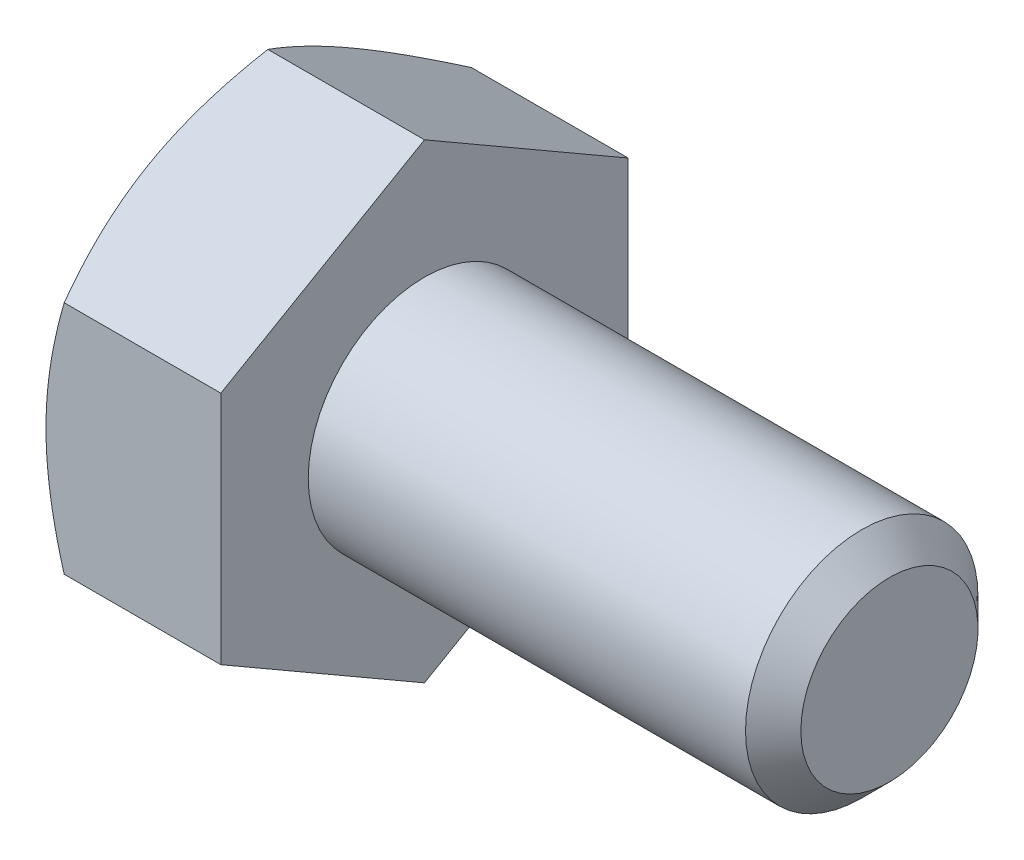
ISO-10303-21;
HEADER;
FILE_DESCRIPTION(('STEP AP214'),'2;1');
FILE_NAME('part.step','',(''),(''),'','','');
FILE_SCHEMA(('AUTOMOTIVE_DESIGN { 1 0 10303 214 1 1 1 1 }'));
ENDSEC;
DATA;
#1=APPLICATION_CONTEXT('core data for automotive mechanical design processes');
#2=APPLICATION_PROTOCOL_DEFINITION('international standard','automotive_design',2000,#1);
#3=PRODUCT_CONTEXT('',#1,'mechanical');
#4=PRODUCT('Part','Part','',(#3));
#5=PRODUCT_RELATED_PRODUCT_CATEGORY('part','',(#4));
#6=PRODUCT_DEFINITION_FORMATION('','',#4);
#7=PRODUCT_DEFINITION_CONTEXT('part definition',#1,'design');
#8=PRODUCT_DEFINITION('design','',#6,#7);
#9=PRODUCT_DEFINITION_SHAPE('','',#8);
#10=(LENGTH_UNIT() NAMED_UNIT(*) SI_UNIT(.MILLI.,.METRE.));
#11=(NAMED_UNIT(*) PLANE_ANGLE_UNIT() SI_UNIT($,.RADIAN.));
#12=(NAMED_UNIT(*) SI_UNIT($,.STERADIAN.) SOLID_ANGLE_UNIT());
#13=UNCERTAINTY_MEASURE_WITH_UNIT(LENGTH_MEASURE(1.E-05),#10,'distance_accuracy_value','');
#14=(GEOMETRIC_REPRESENTATION_CONTEXT(3) GLOBAL_UNCERTAINTY_ASSIGNED_CONTEXT((#13)) GLOBAL_UNIT_ASSIGNED_CONTEXT((#10,
#11,#12)) REPRESENTATION_CONTEXT('',''));
#15=CARTESIAN_POINT('',(0.,0.,0.));
#16=DIRECTION('',(0.,0.,1.));
#17=DIRECTION('',(1.,0.,0.));
#18=AXIS2_PLACEMENT_3D('',#15,#16,#17);
#19=CARTESIAN_POINT('',(4.7752,3.21156860739421,-5.5626));
#20=DIRECTION('',(0.,-0.866025403784438,0.500000000000001));
#21=DIRECTION('',(0.,-0.500000000000001,-0.866025403784438));
#22=AXIS2_PLACEMENT_3D('',#19,#20,#21);
#23=PLANE('',#22);
#24=CARTESIAN_POINT('',(0.496898061070143,6.42325268484227,0.0002));
#25=CARTESIAN_POINT('',(0.45614620225513,6.35265858120791,-0.122072574209491));
#26=CARTESIAN_POINT('',(0.417243775308723,6.2818012683745,-0.244801040124762));
#27=CARTESIAN_POINT('',(0.343647161560542,6.13951120287093,-0.491254662989243));
#28=CARTESIAN_POINT('',(0.308954790139044,6.06807821602765,-0.614980225538197));
#29=CARTESIAN_POINT('',(0.211873701066855,5.85263550648139,-0.98813794459262));
#30=CARTESIAN_POINT('',(0.156654841923373,5.70777535201369,-1.23904309212296));
#31=CARTESIAN_POINT('',(0.0919037861815275,5.49099476252075,-1.61451808721946));
#32=CARTESIAN_POINT('',(0.0734579983429333,5.41972205873199,-1.7379660313744));
#33=CARTESIAN_POINT('',(0.0425268916674615,5.27685459691414,-1.98541973399132));
#34=CARTESIAN_POINT('',(0.030041046189008,5.20525986790488,-2.10942544218948));
#35=CARTESIAN_POINT('',(0.0113480299394708,5.06194605565757,-2.35765224642821));
#36=CARTESIAN_POINT('',(0.00513373340584708,4.9902272065059,-2.48187293701928));
#37=CARTESIAN_POINT('',(-0.000889599359095551,4.84672720555795,-2.7304222295473));
#38=CARTESIAN_POINT('',(-0.000698833448296274,4.7749460557547,-2.85475082803225));
#39=CARTESIAN_POINT('',(0.00862810136342285,4.57828637012706,-3.19537539533985));
#40=CARTESIAN_POINT('',(0.0242873955350757,4.4534722013835,-3.41155987710816));
#41=CARTESIAN_POINT('',(0.0739443233816052,4.20467287416474,-3.84249295274001));
#42=CARTESIAN_POINT('',(0.107958931423458,4.08068859075412,-4.05724003094723));
#43=CARTESIAN_POINT('',(0.192986041409677,3.83138850679899,-4.4890404426887));
#44=CARTESIAN_POINT('',(0.244358813937401,3.70610416511176,-4.70603928788379));
#45=CARTESIAN_POINT('',(0.360954456999593,3.45740388365365,-5.13680081122592));
#46=CARTESIAN_POINT('',(0.426149937617058,3.33398475856357,-5.35056900650764));
#47=CARTESIAN_POINT('',(0.496898061070137,3.21145313734037,-5.5628));
#48=B_SPLINE_CURVE_WITH_KNOTS('',3,(#24,#25,#26,#27,#28,#29,#30,#31,#32,#33,#34,#35,#36,#37,#38,
#39,#40,#41,#42,#43,#44,#45,#46,#47),.UNSPECIFIED.,.F.,.F.,(4,2,2,2,2,2,2,2,2,2,2,4),(0.,
0.44082011856227,0.8818296488474,1.76568130465017,2.19678242164486,2.62784543796583,
3.05841812523868,3.48897751176353,4.23854798324166,4.98881282275669,5.75571809391027,
6.52111769989992),.UNSPECIFIED.);
#49=CARTESIAN_POINT('',(0.496831392605788,6.42313721478843,0.));
#50=VERTEX_POINT('',#49);
#51=CARTESIAN_POINT('',(0.,4.81735291109131,-2.78130000000001));
#52=VERTEX_POINT('',#51);
#53=EDGE_CURVE('E48',#50,#52,#48,.T.);
#54=ORIENTED_EDGE('',*,*,#53,.F.);
#55=DIRECTION('',(-1.,0.,0.));
#56=VECTOR('',#55,1.);
#57=CARTESIAN_POINT('',(4.7752,6.42313721478843,0.));
#58=LINE('',#57,#56);
#59=CARTESIAN_POINT('',(4.7752,6.42313721478843,0.));
#60=VERTEX_POINT('',#59);
#61=EDGE_CURVE('E144',#60,#50,#58,.T.);
#62=ORIENTED_EDGE('',*,*,#61,.F.);
#63=DIRECTION('',(0.,0.500000000000001,0.866025403784438));
#64=VECTOR('',#63,1.);
#65=CARTESIAN_POINT('',(4.7752,3.21156860739421,-5.5626));
#66=LINE('',#65,#64);
#67=CARTESIAN_POINT('',(4.7752,3.21156860739421,-5.5626));
#68=VERTEX_POINT('',#67);
#69=EDGE_CURVE('E235',#68,#60,#66,.T.);
#70=ORIENTED_EDGE('',*,*,#69,.F.);
#71=DIRECTION('',(-1.,0.,0.));
#72=VECTOR('',#71,1.);
#73=CARTESIAN_POINT('',(4.7752,3.21156860739421,-5.5626));
#74=LINE('',#73,#72);
#75=CARTESIAN_POINT('',(0.496831392605783,3.21156860739421,-5.5626));
#76=VERTEX_POINT('',#75);
#77=EDGE_CURVE('E132',#68,#76,#74,.T.);
#78=ORIENTED_EDGE('',*,*,#77,.T.);
#79=EDGE_CURVE('E126',#52,#76,#48,.T.);
#80=ORIENTED_EDGE('',*,*,#79,.F.);
#81=EDGE_LOOP('',(#54,#62,#70,#78,#80));
#82=FACE_BOUND('',#81,.T.);
#83=ADVANCED_FACE('F32',(#82),#23,.F.);
#84=CARTESIAN_POINT('',(4.7752,6.42313721478843,0.));
#85=DIRECTION('',(0.,-0.866025403784438,-0.500000000000001));
#86=DIRECTION('',(0.,0.500000000000001,-0.866025403784438));
#87=AXIS2_PLACEMENT_3D('',#84,#85,#86);
#88=PLANE('',#87);
#89=CARTESIAN_POINT('',(0.496898061070137,3.21145313734037,5.5628));
#90=CARTESIAN_POINT('',(0.456146202255126,3.28204724097473,5.44052742579051));
#91=CARTESIAN_POINT('',(0.417243775308719,3.35290455380814,5.31779895987524));
#92=CARTESIAN_POINT('',(0.343647161560538,3.49519461931171,5.07134533701076));
#93=CARTESIAN_POINT('',(0.30895479013904,3.56662760615498,4.9476197744618));
#94=CARTESIAN_POINT('',(0.211873701066851,3.78207031570124,4.57446205540738));
#95=CARTESIAN_POINT('',(0.156654841923371,3.92693047016895,4.32355690787704));
#96=CARTESIAN_POINT('',(0.0919037861815261,4.14371105966188,3.94808191278055));
#97=CARTESIAN_POINT('',(0.0734579983429319,4.21498376345064,3.82463396862561));
#98=CARTESIAN_POINT('',(0.0425268916674603,4.35785122526849,3.57718026600868));
#99=CARTESIAN_POINT('',(0.0300410461890069,4.42944595427775,3.45317455781052));
#100=CARTESIAN_POINT('',(0.0113480299394699,4.57275976652506,3.20494775357179));
#101=CARTESIAN_POINT('',(0.00513373340584611,4.64447861567674,3.08072706298073));
#102=CARTESIAN_POINT('',(-0.000889599359095831,4.78797861662468,2.8321777704527));
#103=CARTESIAN_POINT('',(-0.000698833448295828,4.85975976642794,2.70784917196775));
#104=CARTESIAN_POINT('',(0.00862810136342449,5.05641945205558,2.36722460466016));
#105=CARTESIAN_POINT('',(0.0242873955350772,5.18123362079914,2.15104012289184));
#106=CARTESIAN_POINT('',(0.0739443233816073,5.4300329480179,1.72010704725999));
#107=CARTESIAN_POINT('',(0.107958931423461,5.55401723142852,1.50535996905277));
#108=CARTESIAN_POINT('',(0.19298604140968,5.80331731538365,1.0735595573113));
#109=CARTESIAN_POINT('',(0.244358813937405,5.92860165707088,0.856560712116213));
#110=CARTESIAN_POINT('',(0.360954456999597,6.17730193852899,0.425799188774084));
#111=CARTESIAN_POINT('',(0.426149937617063,6.30072106361907,0.212030993492364));
#112=CARTESIAN_POINT('',(0.496898061070143,6.42325268484227,-0.000200000000000001));
#113=B_SPLINE_CURVE_WITH_KNOTS('',3,(#89,#90,#91,#92,#93,#94,#95,#96,#97,#98,#99,#100,#101,#102,
#103,#104,#105,#106,#107,#108,#109,#110,#111,#112),.UNSPECIFIED.,.F.,.F.,(4,2,2,2,2,2,2,2,2,2,2,
4),(0.,0.440820118562269,0.881829648847399,1.76568130465016,2.19678242164486,2.62784543796582,
3.05841812523867,3.48897751176352,4.23854798324166,4.98881282275669,5.75571809391027,
6.52111769989992),.UNSPECIFIED.);
#114=CARTESIAN_POINT('',(0.496831392605783,3.21156860739421,5.5626));
#115=VERTEX_POINT('',#114);
#116=CARTESIAN_POINT('',(0.,4.81735291109131,2.78130000000001));
#117=VERTEX_POINT('',#116);
#118=EDGE_CURVE('E55',#115,#117,#113,.T.);
#119=ORIENTED_EDGE('',*,*,#118,.F.);
#120=DIRECTION('',(-1.,0.,0.));
#121=VECTOR('',#120,1.);
#122=CARTESIAN_POINT('',(4.7752,3.21156860739421,5.5626));
#123=LINE('',#122,#121);
#124=CARTESIAN_POINT('',(4.7752,3.21156860739421,5.5626));
#125=VERTEX_POINT('',#124);
#126=EDGE_CURVE('E142',#125,#115,#123,.T.);
#127=ORIENTED_EDGE('',*,*,#126,.F.);
#128=DIRECTION('',(0.,-0.500000000000001,0.866025403784438));
#129=VECTOR('',#128,1.);
#130=CARTESIAN_POINT('',(4.7752,6.42313721478843,0.));
#131=LINE('',#130,#129);
#132=EDGE_CURVE('E233',#60,#125,#131,.T.);
#133=ORIENTED_EDGE('',*,*,#132,.F.);
#134=ORIENTED_EDGE('',*,*,#61,.T.);
#135=EDGE_CURVE('E159',#117,#50,#113,.T.);
#136=ORIENTED_EDGE('',*,*,#135,.F.);
#137=EDGE_LOOP('',(#119,#127,#133,#134,#136));
#138=FACE_BOUND('',#137,.T.);
#139=ADVANCED_FACE('F165',(#138),#88,.F.);
#140=CARTESIAN_POINT('',(4.7752,3.21156860739421,5.5626));
#141=DIRECTION('',(0.,0.,-1.));
#142=DIRECTION('',(0.,1.,0.));
#143=AXIS2_PLACEMENT_3D('',#140,#141,#142);
#144=PLANE('',#143);
#145=CARTESIAN_POINT('',(2.76946298300578,-8.7393190750818,5.5626));
#146=CARTESIAN_POINT('',(2.65067477861527,-8.49536496655185,5.5626));
#147=CARTESIAN_POINT('',(2.53299354463682,-8.25086273482907,5.5626));
#148=CARTESIAN_POINT('',(2.30046552472367,-7.7604709003827,5.5626));
#149=CARTESIAN_POINT('',(2.18561916460972,-7.51458109596807,5.5626));
#150=CARTESIAN_POINT('',(1.9588276573177,-7.01990967875911,5.5626));
#151=CARTESIAN_POINT('',(1.84690075513499,-6.77111967311546,5.5626));
#152=CARTESIAN_POINT('',(1.62748022476041,-6.27159952967086,5.5626));
#153=CARTESIAN_POINT('',(1.51998639425647,-6.02086948102923,5.5626));
#154=CARTESIAN_POINT('',(1.30708686388974,-5.50862062722722,5.5626));
#155=CARTESIAN_POINT('',(1.20187213532634,-5.24702202923404,5.5626));
#156=CARTESIAN_POINT('',(0.999136459179914,-4.72080610855177,5.5626));
#157=CARTESIAN_POINT('',(0.901616358819185,-4.45618845710902,5.5626));
#158=CARTESIAN_POINT('',(0.716747077259983,-3.92397402708936,5.5626));
#159=CARTESIAN_POINT('',(0.629378259967496,-3.65638413524642,5.5626));
#160=CARTESIAN_POINT('',(0.467540995587162,-3.11736467473257,5.5626));
#161=CARTESIAN_POINT('',(0.393068604009403,-2.84593630766607,5.5626));
#162=CARTESIAN_POINT('',(0.260913640631057,-2.30059524064209,5.5626));
#163=CARTESIAN_POINT('',(0.203137923936712,-2.02670547200284,5.5626));
#164=CARTESIAN_POINT('',(0.107584140927259,-1.47536640564423,5.5626));
#165=CARTESIAN_POINT('',(0.0698039297389937,-1.19791749297778,5.5626));
#166=CARTESIAN_POINT('',(0.0306329032322198,-0.782024036094212,5.5626));
#167=CARTESIAN_POINT('',(0.0205033243625241,-0.644369602420743,5.5626));
#168=CARTESIAN_POINT('',(0.00607539244269754,-0.368760083391723,5.5626));
#169=CARTESIAN_POINT('',(0.00177648777087112,-0.230805027714104,5.5626));
#170=CARTESIAN_POINT('',(-0.000882415982739105,0.0451740127451351,5.5626));
#171=CARTESIAN_POINT('',(0.000758104232646437,0.183198002498892,5.5626));
#172=CARTESIAN_POINT('',(0.0099357013266243,0.459040079963629,5.5626));
#173=CARTESIAN_POINT('',(0.017472551860389,0.596858175374894,5.5626));
#174=CARTESIAN_POINT('',(0.0422505229084576,0.924672768817545,5.5626));
#175=CARTESIAN_POINT('',(0.0620998983879061,1.11447655248114,5.5626));
#176=CARTESIAN_POINT('',(0.111925243816852,1.49274006022234,5.5626));
#177=CARTESIAN_POINT('',(0.141902493413722,1.68119961138342,5.5626));
#178=CARTESIAN_POINT('',(0.24544179513394,2.24430469271528,5.5626));
#179=CARTESIAN_POINT('',(0.332595182135706,2.61648784181075,5.5626));
#180=CARTESIAN_POINT('',(0.484580657527375,3.17327423362328,5.5626));
#181=CARTESIAN_POINT('',(0.53953514834987,3.3607403414357,5.5626));
#182=CARTESIAN_POINT('',(0.655361857948686,3.73385345534553,5.5626));
#183=CARTESIAN_POINT('',(0.716234121733455,3.91950044759557,5.5626));
#184=CARTESIAN_POINT('',(0.842902269493743,4.28903174270243,5.5626));
#185=CARTESIAN_POINT('',(0.908696734383907,4.47291653649099,5.5626));
#186=CARTESIAN_POINT('',(1.04441413366768,4.83914665056041,5.5626));
#187=CARTESIAN_POINT('',(1.11433697738278,5.02149200455408,5.5626));
#188=CARTESIAN_POINT('',(1.30616254258249,5.50788800286082,5.5626));
#189=CARTESIAN_POINT('',(1.43118964362203,5.81070522079332,5.5626));
#190=CARTESIAN_POINT('',(1.68847909941209,6.41326146735257,5.5626));
#191=CARTESIAN_POINT('',(1.82074222486502,6.71300016403481,5.5626));
#192=CARTESIAN_POINT('',(2.09080854484645,7.31009693194883,5.5626));
#193=CARTESIAN_POINT('',(2.2286137757305,7.6074540790974,5.5626));
#194=CARTESIAN_POINT('',(2.50845292691855,8.200151033603,5.5626));
#195=CARTESIAN_POINT('',(2.65048668230203,8.49549091908618,5.5626));
#196=CARTESIAN_POINT('',(2.93809441213762,9.08501121353831,5.5626));
#197=CARTESIAN_POINT('',(3.08367358186693,9.37918908275013,5.5626));
#198=CARTESIAN_POINT('',(3.37748078904249,9.96621951864085,5.5626));
#199=CARTESIAN_POINT('',(3.52570884757214,10.2590720747479,5.5626));
#200=CARTESIAN_POINT('',(3.97349977904317,11.1358830052649,5.5626));
#201=CARTESIAN_POINT('',(4.27623214178692,11.7182219945537,5.5626));
#202=CARTESIAN_POINT('',(4.85550678228881,12.8193647810355,5.5626));
#203=CARTESIAN_POINT('',(5.13148986853602,13.3384641758492,5.5626));
#204=CARTESIAN_POINT('',(5.68680572895233,14.3749069872875,5.5626));
#205=CARTESIAN_POINT('',(5.96613870161307,14.8922502975047,5.5626));
#206=CARTESIAN_POINT('',(6.52636532741208,15.9238879385591,5.5626));
#207=CARTESIAN_POINT('',(6.80725083144907,16.4381867017065,5.5626));
#208=CARTESIAN_POINT('',(7.37092859266393,17.4656872191565,5.5626));
#209=CARTESIAN_POINT('',(7.65372070150566,17.9788890548015,5.5626));
#210=CARTESIAN_POINT('',(7.93720779623422,18.4917042787924,5.5626));
#211=B_SPLINE_CURVE_WITH_KNOTS('',3,(#145,#146,#147,#148,#149,#150,#151,#152,#153,#154,#155,
#156,#157,#158,#159,#160,#161,#162,#163,#164,#165,#166,#167,#168,#169,#170,#171,#172,#173,#174,
#175,#176,#177,#178,#179,#180,#181,#182,#183,#184,#185,#186,#187,#188,#189,#190,#191,#192,#193,
#194,#195,#196,#197,#198,#199,#200,#201,#202,#203,#204,#205,#206,#207,#208,#209,#210),
.UNSPECIFIED.,.F.,.F.,(4,2,2,2,2,2,2,2,2,2,2,2,2,2,2,2,2,2,2,2,2,2,2,2,2,2,2,2,2,2,2,2,4),(0.,
0.814023059896039,1.62816765754195,2.44655638702215,3.26490772627512,4.11070764230637,
4.95660055613667,5.80082897545883,6.64479872196119,7.48396511886282,8.32304148200848,
8.73701668482869,9.15095272002817,9.56492494745271,9.97888128433686,10.5510771721585,
11.1233453834466,12.2684477479276,12.8544603660259,13.4404774414739,14.0263262127401,
14.6121621208114,15.5948602808078,16.5776633116356,17.5608308169621,18.5439600269871,
19.5286286939573,20.5133052017346,22.4822323672198,24.245931208995,26.0097350771296,
27.7677407362569,29.5256111634693),.UNSPECIFIED.);
#212=CARTESIAN_POINT('',(0.496831392605779,-3.21156860739419,5.5626));
#213=VERTEX_POINT('',#212);
#214=CARTESIAN_POINT('',(0.,0.,5.5626));
#215=VERTEX_POINT('',#214);
#216=EDGE_CURVE('E245',#213,#215,#211,.T.);
#217=ORIENTED_EDGE('',*,*,#216,.F.);
#218=DIRECTION('',(-1.,0.,0.));
#219=VECTOR('',#218,1.);
#220=CARTESIAN_POINT('',(4.7752,-3.21156860739419,5.5626));
#221=LINE('',#220,#219);
#222=CARTESIAN_POINT('',(4.7752,-3.21156860739419,5.5626));
#223=VERTEX_POINT('',#222);
#224=EDGE_CURVE('E134',#223,#213,#221,.T.);
#225=ORIENTED_EDGE('',*,*,#224,.F.);
#226=DIRECTION('',(0.,-1.,0.));
#227=VECTOR('',#226,1.);
#228=CARTESIAN_POINT('',(4.7752,3.21156860739421,5.5626));
#229=LINE('',#228,#227);
#230=EDGE_CURVE('E229',#125,#223,#229,.T.);
#231=ORIENTED_EDGE('',*,*,#230,.F.);
#232=ORIENTED_EDGE('',*,*,#126,.T.);
#233=EDGE_CURVE('E183',#215,#115,#211,.T.);
#234=ORIENTED_EDGE('',*,*,#233,.F.);
#235=EDGE_LOOP('',(#217,#225,#231,#232,#234));
#236=FACE_BOUND('',#235,.T.);
#237=ADVANCED_FACE('F251',(#236),#144,.F.);
#238=CARTESIAN_POINT('',(4.7752,-6.42313721478842,0.));
#239=DIRECTION('',(0.,0.866025403784438,-0.500000000000002));
#240=DIRECTION('',(0.,0.500000000000002,0.866025403784438));
#241=AXIS2_PLACEMENT_3D('',#238,#239,#240);
#242=PLANE('',#241);
#243=CARTESIAN_POINT('',(0.496898061070138,-6.42325268484226,-0.000200000000000038));
#244=CARTESIAN_POINT('',(0.456146202255126,-6.3526585812079,0.122072574209491));
#245=CARTESIAN_POINT('',(0.417243775308719,-6.28180126837449,0.244801040124762));
#246=CARTESIAN_POINT('',(0.343647161560538,-6.13951120287092,0.491254662989243));
#247=CARTESIAN_POINT('',(0.30895479013904,-6.06807821602765,0.614980225538197));
#248=CARTESIAN_POINT('',(0.21187370106685,-5.85263550648139,0.988137944592619));
#249=CARTESIAN_POINT('',(0.156654841923369,-5.70777535201368,1.23904309212296));
#250=CARTESIAN_POINT('',(0.0919037861815231,-5.49099476252075,1.61451808721945));
#251=CARTESIAN_POINT('',(0.0734579983429287,-5.41972205873199,1.73796603137439));
#252=CARTESIAN_POINT('',(0.0425268916674567,-5.27685459691413,1.98541973399132));
#253=CARTESIAN_POINT('',(0.0300410461890033,-5.20525986790488,2.10942544218948));
#254=CARTESIAN_POINT('',(0.0113480299394658,-5.06194605565756,2.35765224642821));
#255=CARTESIAN_POINT('',(0.00513373340584158,-4.99022720650589,2.48187293701927));
#256=CARTESIAN_POINT('',(-0.00088959935910106,-4.84672720555795,2.73042222954729));
#257=CARTESIAN_POINT('',(-0.000698833448301401,-4.77494605575469,2.85475082803225));
#258=CARTESIAN_POINT('',(0.00862810136341809,-4.57828637012705,3.19537539533984));
#259=CARTESIAN_POINT('',(0.0242873955350705,-4.45347220138349,3.41155987710816));
#260=CARTESIAN_POINT('',(0.0739443233815994,-4.20467287416473,3.84249295274001));
#261=CARTESIAN_POINT('',(0.107958931423452,-4.08068859075411,4.05724003094722));
#262=CARTESIAN_POINT('',(0.192986041409671,-3.83138850679897,4.48904044268869));
#263=CARTESIAN_POINT('',(0.244358813937396,-3.70610416511175,4.70603928788379));
#264=CARTESIAN_POINT('',(0.360954456999589,-3.45740388365364,5.13680081122591));
#265=CARTESIAN_POINT('',(0.426149937617054,-3.33398475856356,5.35056900650764));
#266=CARTESIAN_POINT('',(0.496898061070133,-3.21145313734036,5.5628));
#267=B_SPLINE_CURVE_WITH_KNOTS('',3,(#243,#244,#245,#246,#247,#248,#249,#250,#251,#252,#253,
#254,#255,#256,#257,#258,#259,#260,#261,#262,#263,#264,#265,#266),.UNSPECIFIED.,.F.,.F.,(4,2,2,
2,2,2,2,2,2,2,2,4),(0.,0.44082011856227,0.881829648847399,1.76568130465016,2.19678242164486,
2.62784543796583,3.05841812523868,3.48897751176352,4.23854798324166,4.98881282275669,
5.75571809391028,6.52111769989993),.UNSPECIFIED.);
#268=CARTESIAN_POINT('',(0.496831392605783,-6.42313721478842,0.));
#269=VERTEX_POINT('',#268);
#270=CARTESIAN_POINT('',(0.,-4.81735291109131,2.78130000000001));
#271=VERTEX_POINT('',#270);
#272=EDGE_CURVE('E167',#269,#271,#267,.T.);
#273=ORIENTED_EDGE('',*,*,#272,.F.);
#274=DIRECTION('',(-1.,0.,0.));
#275=VECTOR('',#274,1.);
#276=CARTESIAN_POINT('',(4.7752,-6.42313721478842,0.));
#277=LINE('',#276,#275);
#278=CARTESIAN_POINT('',(4.7752,-6.42313721478842,0.));
#279=VERTEX_POINT('',#278);
#280=EDGE_CURVE('E131',#279,#269,#277,.T.);
#281=ORIENTED_EDGE('',*,*,#280,.F.);
#282=DIRECTION('',(0.,-0.500000000000002,-0.866025403784438));
#283=VECTOR('',#282,1.);
#284=CARTESIAN_POINT('',(4.7752,-6.42313721478842,0.));
#285=LINE('',#284,#283);
#286=EDGE_CURVE('E227',#223,#279,#285,.T.);
#287=ORIENTED_EDGE('',*,*,#286,.F.);
#288=ORIENTED_EDGE('',*,*,#224,.T.);
#289=EDGE_CURVE('E169',#271,#213,#267,.T.);
#290=ORIENTED_EDGE('',*,*,#289,.F.);
#291=EDGE_LOOP('',(#273,#281,#287,#288,#290));
#292=FACE_BOUND('',#291,.T.);
#293=ADVANCED_FACE('F223',(#292),#242,.F.);
#294=CARTESIAN_POINT('',(4.7752,-3.21156860739422,-5.5626));
#295=DIRECTION('',(0.,0.866025403784439,0.499999999999999));
#296=DIRECTION('',(0.,-0.499999999999999,0.866025403784439));
#297=AXIS2_PLACEMENT_3D('',#294,#295,#296);
#298=PLANE('',#297);
#299=CARTESIAN_POINT('',(0.49689806107014,-3.21145313734038,-5.5628));
#300=CARTESIAN_POINT('',(0.456146202255128,-3.28204724097474,-5.44052742579051));
#301=CARTESIAN_POINT('',(0.417243775308721,-3.35290455380815,-5.31779895987524));
#302=CARTESIAN_POINT('',(0.343647161560541,-3.49519461931171,-5.07134533701076));
#303=CARTESIAN_POINT('',(0.308954790139042,-3.56662760615499,-4.9476197744618));
#304=CARTESIAN_POINT('',(0.211873701066853,-3.78207031570125,-4.57446205540738));
#305=CARTESIAN_POINT('',(0.156654841923372,-3.92693047016895,-4.32355690787704));
#306=CARTESIAN_POINT('',(0.0919037861815272,-4.14371105966189,-3.94808191278054));
#307=CARTESIAN_POINT('',(0.0734579983429331,-4.21498376345065,-3.8246339686256));
#308=CARTESIAN_POINT('',(0.0425268916674613,-4.3578512252685,-3.57718026600868));
#309=CARTESIAN_POINT('',(0.0300410461890077,-4.42944595427776,-3.45317455781052));
#310=CARTESIAN_POINT('',(0.0113480299394704,-4.57275976652507,-3.20494775357179));
#311=CARTESIAN_POINT('',(0.00513373340584659,-4.64447861567674,-3.08072706298072));
#312=CARTESIAN_POINT('',(-0.000889599359095559,-4.78797861662469,-2.8321777704527));
#313=CARTESIAN_POINT('',(-0.000698833448295763,-4.85975976642794,-2.70784917196775));
#314=CARTESIAN_POINT('',(0.00862810136342402,-5.05641945205558,-2.36722460466015));
#315=CARTESIAN_POINT('',(0.0242873955350764,-5.18123362079914,-2.15104012289184));
#316=CARTESIAN_POINT('',(0.0739443233816055,-5.4300329480179,-1.72010704725999));
#317=CARTESIAN_POINT('',(0.107958931423458,-5.55401723142852,-1.50535996905277));
#318=CARTESIAN_POINT('',(0.192986041409677,-5.80331731538365,-1.0735595573113));
#319=CARTESIAN_POINT('',(0.244358813937401,-5.92860165707087,-0.856560712116213));
#320=CARTESIAN_POINT('',(0.360954456999593,-6.17730193852898,-0.425799188774084));
#321=CARTESIAN_POINT('',(0.426149937617058,-6.30072106361906,-0.212030993492364));
#322=CARTESIAN_POINT('',(0.496898061070137,-6.42325268484226,0.000199999999999785));
#323=B_SPLINE_CURVE_WITH_KNOTS('',3,(#299,#300,#301,#302,#303,#304,#305,#306,#307,#308,#309,
#310,#311,#312,#313,#314,#315,#316,#317,#318,#319,#320,#321,#322),.UNSPECIFIED.,.F.,.F.,(4,2,2,
2,2,2,2,2,2,2,2,4),(0.,0.44082011856227,0.881829648847399,1.76568130465016,2.19678242164486,
2.62784543796583,3.05841812523868,3.48897751176353,4.23854798324166,4.98881282275669,
5.75571809391027,6.52111769989992),.UNSPECIFIED.);
#324=CARTESIAN_POINT('',(0.496831392605577,-3.21156860739453,-5.5626));
#325=VERTEX_POINT('',#324);
#326=CARTESIAN_POINT('',(0.,-4.81735291109132,-2.7813));
#327=VERTEX_POINT('',#326);
#328=EDGE_CURVE('E108',#325,#327,#323,.T.);
#329=ORIENTED_EDGE('',*,*,#328,.F.);
#330=DIRECTION('',(-1.,0.,0.));
#331=VECTOR('',#330,1.);
#332=CARTESIAN_POINT('',(4.7752,-3.21156860739422,-5.5626));
#333=LINE('',#332,#331);
#334=CARTESIAN_POINT('',(4.7752,-3.21156860739422,-5.5626));
#335=VERTEX_POINT('',#334);
#336=EDGE_CURVE('E122',#335,#325,#333,.T.);
#337=ORIENTED_EDGE('',*,*,#336,.F.);
#338=DIRECTION('',(0.,0.499999999999999,-0.866025403784439));
#339=VECTOR('',#338,1.);
#340=CARTESIAN_POINT('',(4.7752,-3.21156860739422,-5.5626));
#341=LINE('',#340,#339);
#342=EDGE_CURVE('E225',#279,#335,#341,.T.);
#343=ORIENTED_EDGE('',*,*,#342,.F.);
#344=ORIENTED_EDGE('',*,*,#280,.T.);
#345=EDGE_CURVE('E125',#327,#269,#323,.T.);
#346=ORIENTED_EDGE('',*,*,#345,.F.);
#347=EDGE_LOOP('',(#329,#337,#343,#344,#346));
#348=FACE_BOUND('',#347,.T.);
#349=ADVANCED_FACE('F120',(#348),#298,.F.);
#350=CARTESIAN_POINT('',(4.7752,3.21156860739421,-5.5626));
#351=DIRECTION('',(0.,0.,1.));
#352=DIRECTION('',(0.,-1.,0.));
#353=AXIS2_PLACEMENT_3D('',#350,#351,#352);
#354=PLANE('',#353);
#355=CARTESIAN_POINT('',(2.76946298300579,-8.73931907508182,-5.5626));
#356=CARTESIAN_POINT('',(2.65067477861528,-8.49536496655187,-5.5626));
#357=CARTESIAN_POINT('',(2.53299354463683,-8.25086273482909,-5.5626));
#358=CARTESIAN_POINT('',(2.30046552472368,-7.76047090038273,-5.5626));
#359=CARTESIAN_POINT('',(2.18561916460973,-7.51458109596809,-5.5626));
#360=CARTESIAN_POINT('',(1.95882765731771,-7.01990967875913,-5.5626));
#361=CARTESIAN_POINT('',(1.846900755135,-6.77111967311548,-5.5626));
#362=CARTESIAN_POINT('',(1.62748022476042,-6.27159952967089,-5.5626));
#363=CARTESIAN_POINT('',(1.51998639425648,-6.02086948102925,-5.5626));
#364=CARTESIAN_POINT('',(1.30708686388975,-5.50862062722724,-5.5626));
#365=CARTESIAN_POINT('',(1.20187213532635,-5.24702202923406,-5.5626));
#366=CARTESIAN_POINT('',(0.999136459179921,-4.72080610855179,-5.5626));
#367=CARTESIAN_POINT('',(0.901616358819192,-4.45618845710904,-5.5626));
#368=CARTESIAN_POINT('',(0.716747077259989,-3.92397402708938,-5.5626));
#369=CARTESIAN_POINT('',(0.629378259967502,-3.65638413524644,-5.5626));
#370=CARTESIAN_POINT('',(0.467540995587167,-3.11736467473259,-5.5626));
#371=CARTESIAN_POINT('',(0.393068604009408,-2.84593630766609,-5.5626));
#372=CARTESIAN_POINT('',(0.260913640631061,-2.3005952406421,-5.5626));
#373=CARTESIAN_POINT('',(0.203137923936715,-2.02670547200286,-5.5626));
#374=CARTESIAN_POINT('',(0.107584140927261,-1.47536640564425,-5.5626));
#375=CARTESIAN_POINT('',(0.0698039297389959,-1.19791749297779,-5.5626));
#376=CARTESIAN_POINT('',(0.0306329032322217,-0.782024036094228,-5.5626));
#377=CARTESIAN_POINT('',(0.0205033243625259,-0.644369602420759,-5.5626));
#378=CARTESIAN_POINT('',(0.00607539244269882,-0.368760083391737,-5.5626));
#379=CARTESIAN_POINT('',(0.00177648777087202,-0.230805027714119,-5.5626));
#380=CARTESIAN_POINT('',(-0.000882415982738997,0.0451740127451205,-5.5626));
#381=CARTESIAN_POINT('',(0.000758104232646156,0.183198002498878,-5.5626));
#382=CARTESIAN_POINT('',(0.00993570132662356,0.459040079963614,-5.5626));
#383=CARTESIAN_POINT('',(0.0174725518603882,0.596858175374879,-5.5626));
#384=CARTESIAN_POINT('',(0.0422505229084564,0.924672768817529,-5.5626));
#385=CARTESIAN_POINT('',(0.0620998983879045,1.11447655248113,-5.5626));
#386=CARTESIAN_POINT('',(0.111925243816849,1.49274006022233,-5.5626));
#387=CARTESIAN_POINT('',(0.141902493413719,1.6811996113834,-5.5626));
#388=CARTESIAN_POINT('',(0.245441795133936,2.24430469271526,-5.5626));
#389=CARTESIAN_POINT('',(0.332595182135701,2.61648784181073,-5.5626));
#390=CARTESIAN_POINT('',(0.484580657527369,3.17327423362326,-5.5626));
#391=CARTESIAN_POINT('',(0.539535148349865,3.36074034143568,-5.5626));
#392=CARTESIAN_POINT('',(0.655361857948679,3.7338534553455,-5.5626));
#393=CARTESIAN_POINT('',(0.716234121733449,3.91950044759555,-5.5626));
#394=CARTESIAN_POINT('',(0.842902269493736,4.28903174270241,-5.5626));
#395=CARTESIAN_POINT('',(0.908696734383899,4.47291653649097,-5.5626));
#396=CARTESIAN_POINT('',(1.04441413366767,4.83914665056038,-5.5626));
#397=CARTESIAN_POINT('',(1.11433697738277,5.02149200455406,-5.5626));
#398=CARTESIAN_POINT('',(1.30616254258248,5.5078880028608,-5.5626));
#399=CARTESIAN_POINT('',(1.43118964362202,5.81070522079329,-5.5626));
#400=CARTESIAN_POINT('',(1.68847909941208,6.41326146735254,-5.5626));
#401=CARTESIAN_POINT('',(1.82074222486501,6.71300016403479,-5.5626));
#402=CARTESIAN_POINT('',(2.09080854484644,7.31009693194881,-5.5626));
#403=CARTESIAN_POINT('',(2.22861377573049,7.60745407909738,-5.5626));
#404=CARTESIAN_POINT('',(2.50845292691854,8.20015103360298,-5.5626));
#405=CARTESIAN_POINT('',(2.65048668230202,8.49549091908616,-5.5626));
#406=CARTESIAN_POINT('',(2.93809441213761,9.08501121353829,-5.5626));
#407=CARTESIAN_POINT('',(3.08367358186692,9.37918908275011,-5.5626));
#408=CARTESIAN_POINT('',(3.37748078904248,9.96621951864084,-5.5626));
#409=CARTESIAN_POINT('',(3.52570884757214,10.2590720747478,-5.5626));
#410=CARTESIAN_POINT('',(3.97349977904316,11.1358830052649,-5.5626));
#411=CARTESIAN_POINT('',(4.27623214178691,11.7182219945536,-5.5626));
#412=CARTESIAN_POINT('',(4.8555067822888,12.8193647810355,-5.5626));
#413=CARTESIAN_POINT('',(5.13148986853601,13.3384641758492,-5.5626));
#414=CARTESIAN_POINT('',(5.68680572895232,14.3749069872875,-5.5626));
#415=CARTESIAN_POINT('',(5.96613870161306,14.8922502975047,-5.5626));
#416=CARTESIAN_POINT('',(6.52636532741208,15.9238879385591,-5.5626));
#417=CARTESIAN_POINT('',(6.80725083144907,16.4381867017065,-5.5626));
#418=CARTESIAN_POINT('',(7.37092859266394,17.4656872191565,-5.5626));
#419=CARTESIAN_POINT('',(7.65372070150567,17.9788890548015,-5.5626));
#420=CARTESIAN_POINT('',(7.93720779623422,18.4917042787924,-5.5626));
#421=B_SPLINE_CURVE_WITH_KNOTS('',3,(#355,#356,#357,#358,#359,#360,#361,#362,#363,#364,#365,
#366,#367,#368,#369,#370,#371,#372,#373,#374,#375,#376,#377,#378,#379,#380,#381,#382,#383,#384,
#385,#386,#387,#388,#389,#390,#391,#392,#393,#394,#395,#396,#397,#398,#399,#400,#401,#402,#403,
#404,#405,#406,#407,#408,#409,#410,#411,#412,#413,#414,#415,#416,#417,#418,#419,#420),
.UNSPECIFIED.,.F.,.F.,(4,2,2,2,2,2,2,2,2,2,2,2,2,2,2,2,2,2,2,2,2,2,2,2,2,2,2,2,2,2,2,2,4),(0.,
0.814023059896039,1.62816765754195,2.44655638702216,3.26490772627512,4.11070764230638,
4.95660055613668,5.80082897545884,6.6447987219612,7.48396511886283,8.32304148200849,
8.7370166848287,9.15095272002818,9.56492494745272,9.97888128433688,10.5510771721585,
11.1233453834466,12.2684477479276,12.8544603660259,13.4404774414739,14.0263262127401,
14.6121621208114,15.5948602808078,16.5776633116356,17.5608308169621,18.5439600269871,
19.5286286939574,20.5133052017346,22.4822323672198,24.245931208995,26.0097350771296,
27.7677407362569,29.5256111634693),.UNSPECIFIED.);
#422=CARTESIAN_POINT('',(0.,0.,-5.5626));
#423=VERTEX_POINT('',#422);
#424=EDGE_CURVE('E114',#76,#423,#421,.F.);
#425=ORIENTED_EDGE('',*,*,#424,.F.);
#426=ORIENTED_EDGE('',*,*,#77,.F.);
#427=DIRECTION('',(0.,1.,0.));
#428=VECTOR('',#427,1.);
#429=CARTESIAN_POINT('',(4.7752,3.21156860739421,-5.5626));
#430=LINE('',#429,#428);
#431=EDGE_CURVE('E130',#335,#68,#430,.T.);
#432=ORIENTED_EDGE('',*,*,#431,.F.);
#433=ORIENTED_EDGE('',*,*,#336,.T.);
#434=EDGE_CURVE('E105',#423,#325,#421,.F.);
#435=ORIENTED_EDGE('',*,*,#434,.F.);
#436=EDGE_LOOP('',(#425,#426,#432,#433,#435));
#437=FACE_BOUND('',#436,.T.);
#438=ADVANCED_FACE('F128',(#437),#354,.F.);
#439=CARTESIAN_POINT('',(4.7752,6.42313721478843,0.));
#440=DIRECTION('',(1.,0.,0.));
#441=DIRECTION('',(0.,0.,-1.));
#442=AXIS2_PLACEMENT_3D('',#439,#440,#441);
#443=PLANE('',#442);
#444=CARTESIAN_POINT('',(4.7752,0.,0.));
#445=DIRECTION('',(1.,0.,0.));
#446=DIRECTION('',(0.,0.,-1.));
#447=AXIS2_PLACEMENT_3D('',#444,#445,#446);
#448=CIRCLE('',#447,3.175);
#449=CARTESIAN_POINT('',(4.7752,0.,-3.175));
#450=VERTEX_POINT('',#449);
#451=EDGE_CURVE('E238',#450,#450,#448,.F.);
#452=ORIENTED_EDGE('',*,*,#451,.T.);
#453=EDGE_LOOP('',(#452));
#454=FACE_BOUND('',#453,.T.);
#455=ORIENTED_EDGE('',*,*,#69,.T.);
#456=ORIENTED_EDGE('',*,*,#132,.T.);
#457=ORIENTED_EDGE('',*,*,#230,.T.);
#458=ORIENTED_EDGE('',*,*,#286,.T.);
#459=ORIENTED_EDGE('',*,*,#342,.T.);
#460=ORIENTED_EDGE('',*,*,#431,.T.);
#461=EDGE_LOOP('',(#455,#456,#457,#458,#459,#460));
#462=FACE_BOUND('',#461,.T.);
#463=ADVANCED_FACE('F253',(#454,#462),#443,.T.);
#464=CARTESIAN_POINT('',(0.,0.,0.));
#465=DIRECTION('',(-1.,0.,0.));
#466=DIRECTION('',(0.,0.,1.));
#467=AXIS2_PLACEMENT_3D('',#464,#465,#466);
#468=CYLINDRICAL_SURFACE('',#467,3.175);
#469=ORIENTED_EDGE('',*,*,#451,.F.);
#470=EDGE_LOOP('',(#469));
#471=FACE_BOUND('',#470,.T.);
#472=CARTESIAN_POINT('',(16.71955,0.,0.));
#473=DIRECTION('',(-1.,0.,0.));
#474=DIRECTION('',(0.,0.,1.));
#475=AXIS2_PLACEMENT_3D('',#472,#473,#474);
#476=CIRCLE('',#475,3.175);
#477=CARTESIAN_POINT('',(16.71955,0.,3.175));
#478=VERTEX_POINT('',#477);
#479=EDGE_CURVE('E241',#478,#478,#476,.T.);
#480=ORIENTED_EDGE('',*,*,#479,.T.);
#481=EDGE_LOOP('',(#480));
#482=FACE_BOUND('',#481,.T.);
#483=ADVANCED_FACE('F284',(#471,#482),#468,.T.);
#484=CARTESIAN_POINT('',(17.4752,0.,0.));
#485=DIRECTION('',(-1.,0.,0.));
#486=DIRECTION('',(0.,0.,1.));
#487=AXIS2_PLACEMENT_3D('',#484,#485,#486);
#488=CONICAL_SURFACE('',#487,2.41935,0.785398163397442);
#489=ORIENTED_EDGE('',*,*,#479,.F.);
#490=EDGE_LOOP('',(#489));
#491=FACE_BOUND('',#490,.T.);
#492=CARTESIAN_POINT('',(17.4752,0.,0.));
#493=DIRECTION('',(-1.,0.,0.));
#494=DIRECTION('',(0.,0.,1.));
#495=AXIS2_PLACEMENT_3D('',#492,#493,#494);
#496=CIRCLE('',#495,2.41935);
#497=CARTESIAN_POINT('',(17.4752,0.,2.41935));
#498=VERTEX_POINT('',#497);
#499=EDGE_CURVE('E243',#498,#498,#496,.T.);
#500=ORIENTED_EDGE('',*,*,#499,.T.);
#501=EDGE_LOOP('',(#500));
#502=FACE_BOUND('',#501,.T.);
#503=ADVANCED_FACE('F287',(#491,#502),#488,.T.);
#504=CARTESIAN_POINT('',(17.4752,0.,0.));
#505=DIRECTION('',(-1.,0.,0.));
#506=DIRECTION('',(0.,0.,1.));
#507=AXIS2_PLACEMENT_3D('',#504,#505,#506);
#508=PLANE('',#507);
#509=ORIENTED_EDGE('',*,*,#499,.F.);
#510=EDGE_LOOP('',(#509));
#511=FACE_BOUND('',#510,.T.);
#512=ADVANCED_FACE('F197',(#511),#508,.F.);
#513=CARTESIAN_POINT('',(0.,0.,0.));
#514=DIRECTION('',(1.,0.,0.));
#515=DIRECTION('',(0.,0.,-1.));
#516=AXIS2_PLACEMENT_3D('',#513,#514,#515);
#517=CONICAL_SURFACE('',#516,5.5626,1.0471975511966);
#518=ORIENTED_EDGE('',*,*,#328,.T.);
#519=CARTESIAN_POINT('',(0.,0.,0.));
#520=DIRECTION('',(1.,0.,0.));
#521=DIRECTION('',(0.,0.,-1.));
#522=AXIS2_PLACEMENT_3D('',#519,#520,#521);
#523=CIRCLE('',#522,5.5626);
#524=EDGE_CURVE('E36',#327,#423,#523,.T.);
#525=ORIENTED_EDGE('',*,*,#524,.T.);
#526=ORIENTED_EDGE('',*,*,#434,.T.);
#527=EDGE_LOOP('',(#518,#525,#526));
#528=FACE_BOUND('',#527,.T.);
#529=ADVANCED_FACE('F107',(#528),#517,.T.);
#530=ORIENTED_EDGE('',*,*,#272,.T.);
#531=EDGE_CURVE('E149',#271,#327,#523,.T.);
#532=ORIENTED_EDGE('',*,*,#531,.T.);
#533=ORIENTED_EDGE('',*,*,#345,.T.);
#534=EDGE_LOOP('',(#530,#532,#533));
#535=FACE_BOUND('',#534,.T.);
#536=ADVANCED_FACE('F196',(#535),#517,.T.);
#537=ORIENTED_EDGE('',*,*,#216,.T.);
#538=EDGE_CURVE('E150',#215,#271,#523,.T.);
#539=ORIENTED_EDGE('',*,*,#538,.T.);
#540=ORIENTED_EDGE('',*,*,#289,.T.);
#541=EDGE_LOOP('',(#537,#539,#540));
#542=FACE_BOUND('',#541,.T.);
#543=ADVANCED_FACE('F191',(#542),#517,.T.);
#544=ORIENTED_EDGE('',*,*,#233,.T.);
#545=ORIENTED_EDGE('',*,*,#118,.T.);
#546=CARTESIAN_POINT('',(0.,0.,0.));
#547=DIRECTION('',(-1.,0.,0.));
#548=DIRECTION('',(0.,0.,1.));
#549=AXIS2_PLACEMENT_3D('',#546,#547,#548);
#550=CIRCLE('',#549,5.5626);
#551=EDGE_CURVE('E115',#215,#117,#550,.T.);
#552=ORIENTED_EDGE('',*,*,#551,.F.);
#553=EDGE_LOOP('',(#544,#545,#552));
#554=FACE_BOUND('',#553,.T.);
#555=ADVANCED_FACE('F195',(#554),#517,.T.);
#556=ORIENTED_EDGE('',*,*,#135,.T.);
#557=ORIENTED_EDGE('',*,*,#53,.T.);
#558=EDGE_CURVE('E41',#52,#117,#523,.T.);
#559=ORIENTED_EDGE('',*,*,#558,.T.);
#560=EDGE_LOOP('',(#556,#557,#559));
#561=FACE_BOUND('',#560,.T.);
#562=ADVANCED_FACE('F158',(#561),#517,.T.);
#563=ORIENTED_EDGE('',*,*,#79,.T.);
#564=ORIENTED_EDGE('',*,*,#424,.T.);
#565=EDGE_CURVE('E11',#423,#52,#523,.T.);
#566=ORIENTED_EDGE('',*,*,#565,.T.);
#567=EDGE_LOOP('',(#563,#564,#566));
#568=FACE_BOUND('',#567,.T.);
#569=ADVANCED_FACE('F256',(#568),#517,.T.);
#570=CARTESIAN_POINT('',(0.,6.42313721478843,0.));
#571=DIRECTION('',(1.,0.,0.));
#572=DIRECTION('',(0.,0.,-1.));
#573=AXIS2_PLACEMENT_3D('',#570,#571,#572);
#574=PLANE('',#573);
#575=ORIENTED_EDGE('',*,*,#565,.F.);
#576=ORIENTED_EDGE('',*,*,#524,.F.);
#577=ORIENTED_EDGE('',*,*,#531,.F.);
#578=ORIENTED_EDGE('',*,*,#538,.F.);
#579=ORIENTED_EDGE('',*,*,#551,.T.);
#580=ORIENTED_EDGE('',*,*,#558,.F.);
#581=EDGE_LOOP('',(#575,#576,#577,#578,#579,#580));
#582=FACE_BOUND('',#581,.T.);
#583=ADVANCED_FACE('F162',(#582),#574,.F.);
#584=CLOSED_SHELL('',(#83,#139,#237,#293,#349,#438,#463,#483,#503,#512,#529,#536,#543,#555,#562,
#569,#583));
#585=MANIFOLD_SOLID_BREP('B2',#584);
#586=ADVANCED_BREP_SHAPE_REPRESENTATION('',(#18,#585),#14);
#587=SHAPE_DEFINITION_REPRESENTATION(#9,#586);
ENDSEC;
END-ISO-10303-21;
